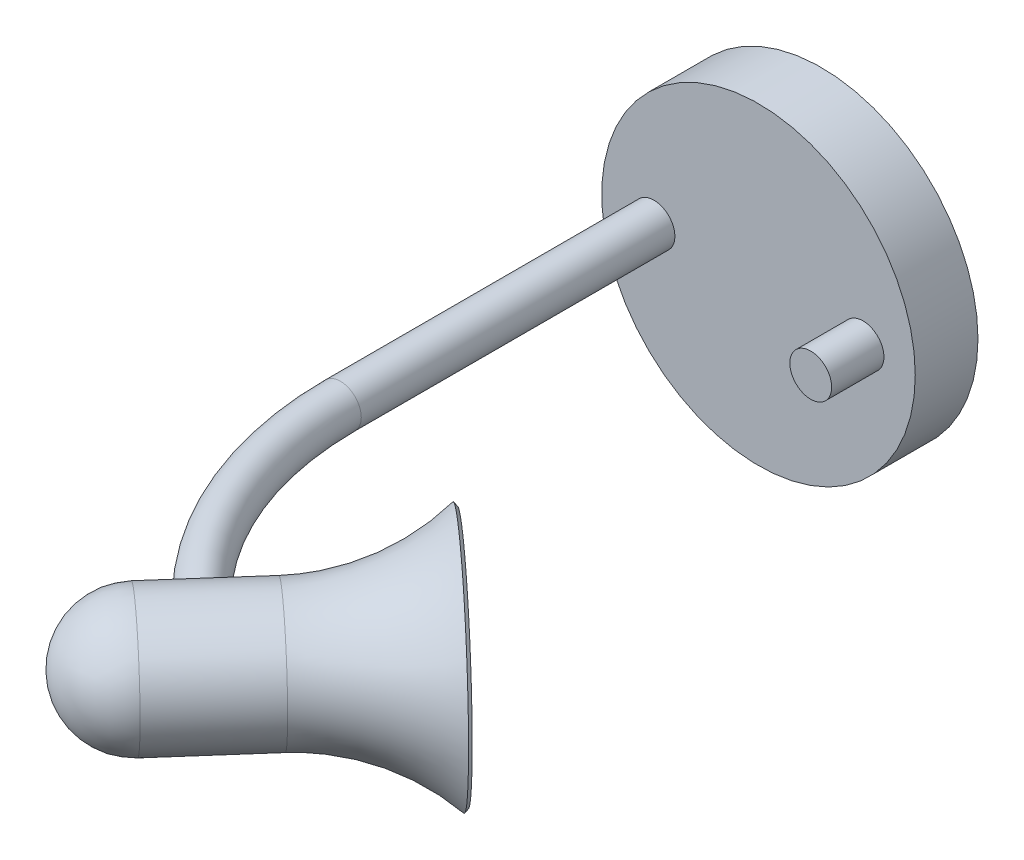
ISO-10303-21;
HEADER;
FILE_DESCRIPTION(('STEP AP214'),'2;1');
FILE_NAME('part.step','',(''),(''),'','','');
FILE_SCHEMA(('AUTOMOTIVE_DESIGN { 1 0 10303 214 1 1 1 1 }'));
ENDSEC;
DATA;
#1=APPLICATION_CONTEXT('core data for automotive mechanical design processes');
#2=APPLICATION_PROTOCOL_DEFINITION('international standard','automotive_design',2000,#1);
#3=PRODUCT_CONTEXT('',#1,'mechanical');
#4=PRODUCT('Part','Part','',(#3));
#5=PRODUCT_RELATED_PRODUCT_CATEGORY('part','',(#4));
#6=PRODUCT_DEFINITION_FORMATION('','',#4);
#7=PRODUCT_DEFINITION_CONTEXT('part definition',#1,'design');
#8=PRODUCT_DEFINITION('design','',#6,#7);
#9=PRODUCT_DEFINITION_SHAPE('','',#8);
#10=(LENGTH_UNIT() NAMED_UNIT(*) SI_UNIT(.MILLI.,.METRE.));
#11=(NAMED_UNIT(*) PLANE_ANGLE_UNIT() SI_UNIT($,.RADIAN.));
#12=(NAMED_UNIT(*) SI_UNIT($,.STERADIAN.) SOLID_ANGLE_UNIT());
#13=UNCERTAINTY_MEASURE_WITH_UNIT(LENGTH_MEASURE(1.E-05),#10,'distance_accuracy_value','');
#14=(GEOMETRIC_REPRESENTATION_CONTEXT(3) GLOBAL_UNCERTAINTY_ASSIGNED_CONTEXT((#13)) GLOBAL_UNIT_ASSIGNED_CONTEXT((#10,
#11,#12)) REPRESENTATION_CONTEXT('',''));
#15=CARTESIAN_POINT('',(0.,0.,0.));
#16=DIRECTION('',(0.,0.,1.));
#17=DIRECTION('',(1.,0.,0.));
#18=AXIS2_PLACEMENT_3D('',#15,#16,#17);
#19=CARTESIAN_POINT('',(43.20589325157,0.,301.093134832984));
#20=DIRECTION('',(0.661437827766148,0.,-0.75));
#21=DIRECTION('',(-0.75,0.,-0.661437827766148));
#22=AXIS2_PLACEMENT_3D('',#19,#20,#21);
#23=TOROIDAL_SURFACE('',#22,120.,92.);
#24=CARTESIAN_POINT('',(83.6939830923323,0.,255.183956213542));
#25=DIRECTION('',(0.661437827766148,0.,-0.75));
#26=DIRECTION('',(-0.75,0.,-0.661437827766148));
#27=AXIS2_PLACEMENT_3D('',#24,#25,#26);
#28=CIRCLE('',#27,51.319130032195);
#29=CARTESIAN_POINT('',(122.183330616479,0.,289.128370104886));
#30=VERTEX_POINT('',#29);
#31=EDGE_CURVE('E11',#30,#30,#28,.T.);
#32=ORIENTED_EDGE('',*,*,#31,.T.);
#33=EDGE_LOOP('',(#32));
#34=FACE_BOUND('',#33,.T.);
#35=CARTESIAN_POINT('',(43.20589325157,0.,301.093134832984));
#36=DIRECTION('',(0.661437827766148,0.,-0.75));
#37=DIRECTION('',(-0.75,0.,-0.661437827766148));
#38=AXIS2_PLACEMENT_3D('',#35,#36,#37);
#39=CIRCLE('',#38,28.);
#40=CARTESIAN_POINT('',(22.20589325157,0.,282.572875655532));
#41=VERTEX_POINT('',#40);
#42=EDGE_CURVE('E63',#41,#41,#39,.T.);
#43=ORIENTED_EDGE('',*,*,#42,.F.);
#44=EDGE_LOOP('',(#43));
#45=FACE_BOUND('',#44,.T.);
#46=ADVANCED_FACE('F41',(#34,#45),#23,.T.);
#47=CARTESIAN_POINT('',(82.8138072262288,0.,256.181981835704));
#48=DIRECTION('',(-0.661437827766148,0.,0.75));
#49=DIRECTION('',(0.75,0.,0.661437827766148));
#50=AXIS2_PLACEMENT_3D('',#47,#48,#49);
#51=CONICAL_SURFACE('',#50,52.8121924227995,0.842833216253935);
#52=CARTESIAN_POINT('',(82.8138072262288,0.,256.181981835704));
#53=DIRECTION('',(0.661437827766148,0.,-0.75));
#54=DIRECTION('',(-0.75,0.,-0.661437827766148));
#55=AXIS2_PLACEMENT_3D('',#52,#53,#54);
#56=CIRCLE('',#55,52.8121924227995);
#57=CARTESIAN_POINT('',(122.422951543328,0.,291.113963671408));
#58=VERTEX_POINT('',#57);
#59=EDGE_CURVE('E47',#58,#58,#56,.T.);
#60=CARTESIAN_POINT('',(122.183330616479,0.,289.128370104886));
#61=CARTESIAN_POINT('',(122.1858266678,0.,289.149053371204));
#62=CARTESIAN_POINT('',(122.188322719121,0.,289.169736637522));
#63=CARTESIAN_POINT('',(122.193314821764,0.,289.211103170158));
#64=CARTESIAN_POINT('',(122.195810873085,0.,289.231786436476));
#65=CARTESIAN_POINT('',(122.200802975728,0.,289.273152969112));
#66=CARTESIAN_POINT('',(122.203299027049,0.,289.293836235429));
#67=CARTESIAN_POINT('',(122.208291129692,0.,289.335202768065));
#68=CARTESIAN_POINT('',(122.210787181013,0.,289.355886034383));
#69=CARTESIAN_POINT('',(122.215779283656,0.,289.397252567019));
#70=CARTESIAN_POINT('',(122.218275334978,0.,289.417935833337));
#71=CARTESIAN_POINT('',(122.22326743762,0.,289.459302365973));
#72=CARTESIAN_POINT('',(122.225763488942,0.,289.479985632291));
#73=CARTESIAN_POINT('',(122.230755591584,0.,289.521352164927));
#74=CARTESIAN_POINT('',(122.233251642906,0.,289.542035431245));
#75=CARTESIAN_POINT('',(122.238243745548,0.,289.583401963881));
#76=CARTESIAN_POINT('',(122.24073979687,0.,289.604085230199));
#77=CARTESIAN_POINT('',(122.245731899512,0.,289.645451762835));
#78=CARTESIAN_POINT('',(122.248227950834,0.,289.666135029152));
#79=CARTESIAN_POINT('',(122.253220053476,0.,289.707501561788));
#80=CARTESIAN_POINT('',(122.255716104798,0.,289.728184828106));
#81=CARTESIAN_POINT('',(122.260708207441,0.,289.769551360742));
#82=CARTESIAN_POINT('',(122.263204258762,0.,289.79023462706));
#83=CARTESIAN_POINT('',(122.268196361405,0.,289.831601159696));
#84=CARTESIAN_POINT('',(122.270692412726,0.,289.852284426014));
#85=CARTESIAN_POINT('',(122.275684515369,0.,289.89365095865));
#86=CARTESIAN_POINT('',(122.27818056669,0.,289.914334224968));
#87=CARTESIAN_POINT('',(122.283172669333,0.,289.955700757604));
#88=CARTESIAN_POINT('',(122.285668720654,0.,289.976384023922));
#89=CARTESIAN_POINT('',(122.290660823297,0.,290.017750556557));
#90=CARTESIAN_POINT('',(122.293156874618,0.,290.038433822875));
#91=CARTESIAN_POINT('',(122.298148977261,0.,290.079800355511));
#92=CARTESIAN_POINT('',(122.300645028582,0.,290.100483621829));
#93=CARTESIAN_POINT('',(122.305637131225,0.,290.141850154465));
#94=CARTESIAN_POINT('',(122.308133182546,0.,290.162533420783));
#95=CARTESIAN_POINT('',(122.313125285189,0.,290.203899953419));
#96=CARTESIAN_POINT('',(122.31562133651,0.,290.224583219737));
#97=CARTESIAN_POINT('',(122.320613439153,0.,290.265949752373));
#98=CARTESIAN_POINT('',(122.323109490474,0.,290.286633018691));
#99=CARTESIAN_POINT('',(122.328101593117,0.,290.327999551327));
#100=CARTESIAN_POINT('',(122.330597644438,0.,290.348682817645));
#101=CARTESIAN_POINT('',(122.335589747081,0.,290.39004935028));
#102=CARTESIAN_POINT('',(122.338085798402,0.,290.410732616598));
#103=CARTESIAN_POINT('',(122.343077901045,0.,290.452099149234));
#104=CARTESIAN_POINT('',(122.345573952367,0.,290.472782415552));
#105=CARTESIAN_POINT('',(122.350566055009,0.,290.514148948188));
#106=CARTESIAN_POINT('',(122.353062106331,0.,290.534832214506));
#107=CARTESIAN_POINT('',(122.358054208973,0.,290.576198747142));
#108=CARTESIAN_POINT('',(122.360550260295,0.,290.59688201346));
#109=CARTESIAN_POINT('',(122.365542362937,0.,290.638248546096));
#110=CARTESIAN_POINT('',(122.368038414259,0.,290.658931812414));
#111=CARTESIAN_POINT('',(122.373030516901,0.,290.70029834505));
#112=CARTESIAN_POINT('',(122.375526568223,0.,290.720981611368));
#113=CARTESIAN_POINT('',(122.380518670865,0.,290.762348144003));
#114=CARTESIAN_POINT('',(122.383014722187,0.,290.783031410321));
#115=CARTESIAN_POINT('',(122.388006824829,0.,290.824397942957));
#116=CARTESIAN_POINT('',(122.390502876151,0.,290.845081209275));
#117=CARTESIAN_POINT('',(122.395494978794,0.,290.886447741911));
#118=CARTESIAN_POINT('',(122.397991030115,0.,290.907131008229));
#119=CARTESIAN_POINT('',(122.402983132758,0.,290.948497540865));
#120=CARTESIAN_POINT('',(122.405479184079,0.,290.969180807183));
#121=CARTESIAN_POINT('',(122.410471286722,0.,291.010547339819));
#122=CARTESIAN_POINT('',(122.412967338043,0.,291.031230606137));
#123=CARTESIAN_POINT('',(122.417959440686,0.,291.072597138773));
#124=CARTESIAN_POINT('',(122.420455492007,0.,291.093280405091));
#125=CARTESIAN_POINT('',(122.422951543328,0.,291.113963671408));
#126=B_SPLINE_CURVE_WITH_KNOTS('',3,(#60,#61,#62,#63,#64,#65,#66,#67,#68,#69,#70,#71,#72,#73,
#74,#75,#76,#77,#78,#79,#80,#81,#82,#83,#84,#85,#86,#87,#88,#89,#90,#91,#92,#93,#94,#95,#96,#97,
#98,#99,#100,#101,#102,#103,#104,#105,#106,#107,#108,#109,#110,#111,#112,#113,#114,#115,#116,
#117,#118,#119,#120,#121,#122,#123,#124,#125),.UNSPECIFIED.,.F.,.F.,(4,2,2,2,2,2,2,2,2,2,2,2,2,
2,2,2,2,2,2,2,2,2,2,2,2,2,2,2,2,2,2,2,4),(0.,0.062499999999971,0.124999999999944,
0.187500000000025,0.249999999999997,0.312499999999967,0.374999999999939,0.437500000000022,
0.499999999999995,0.562499999999968,0.624999999999937,0.68750000000002,0.749999999999992,
0.812499999999963,0.874999999999934,0.937500000000017,0.99999999999999,1.06249999999996,
1.12499999999999,1.18750000000001,1.24999999999999,1.31249999999996,1.37500000000004,
1.43750000000001,1.49999999999999,1.56250000000001,1.62500000000004,1.68750000000001,
1.74999999999998,1.81250000000001,1.87500000000004,1.93750000000001,2.00000000000004),.UNSPECIFIED.);
#127=EDGE_CURVE('BSEAM71',#30,#58,#126,.T.);
#128=ORIENTED_EDGE('',*,*,#31,.F.);
#129=ORIENTED_EDGE('',*,*,#59,.T.);
#130=ORIENTED_EDGE('',*,*,#127,.T.);
#131=ORIENTED_EDGE('',*,*,#127,.F.);
#132=EDGE_LOOP('',(#128,#130,#129,#131));
#133=FACE_BOUND('',#132,.T.);
#134=ADVANCED_FACE('F71',(#133),#51,.T.);
#135=CARTESIAN_POINT('',(43.20589325157,0.,301.093134832984));
#136=DIRECTION('',(0.661437827766148,0.,-0.75));
#137=DIRECTION('',(-0.75,0.,-0.661437827766148));
#138=AXIS2_PLACEMENT_3D('',#135,#136,#137);
#139=TOROIDAL_SURFACE('',#138,120.,90.);
#140=ORIENTED_EDGE('',*,*,#59,.F.);
#141=EDGE_LOOP('',(#140));
#142=FACE_BOUND('',#141,.T.);
#143=CARTESIAN_POINT('',(43.20589325157,0.,301.093134832984));
#144=DIRECTION('',(0.661437827766148,0.,-0.75));
#145=DIRECTION('',(-0.75,0.,-0.661437827766148));
#146=AXIS2_PLACEMENT_3D('',#143,#144,#145);
#147=CIRCLE('',#146,30.);
#148=CARTESIAN_POINT('',(20.70589325157,0.,281.25));
#149=VERTEX_POINT('',#148);
#150=EDGE_CURVE('E51',#149,#149,#147,.T.);
#151=ORIENTED_EDGE('',*,*,#150,.T.);
#152=EDGE_LOOP('',(#151));
#153=FACE_BOUND('',#152,.T.);
#154=ADVANCED_FACE('F75',(#142,#153),#139,.F.);
#155=CARTESIAN_POINT('',(158.834137133066,0.,169.983030042028));
#156=DIRECTION('',(0.661437827766148,0.,-0.75));
#157=DIRECTION('',(-0.75,0.,-0.661437827766148));
#158=AXIS2_PLACEMENT_3D('',#155,#156,#157);
#159=CYLINDRICAL_SURFACE('',#158,30.);
#160=CARTESIAN_POINT('',(10.1340018632626,0.,338.593134832984));
#161=DIRECTION('',(0.661437827766148,0.,-0.75));
#162=DIRECTION('',(-0.75,0.,-0.661437827766148));
#163=AXIS2_PLACEMENT_3D('',#160,#161,#162);
#164=CIRCLE('',#163,30.);
#165=CARTESIAN_POINT('',(-12.3659981367374,0.,318.75));
#166=VERTEX_POINT('',#165);
#167=EDGE_CURVE('E55',#166,#166,#164,.T.);
#168=CARTESIAN_POINT('',(20.70589325157,0.,281.25));
#169=CARTESIAN_POINT('',(20.3613943829418,0.,281.640625));
#170=CARTESIAN_POINT('',(20.0168955143136,0.,282.03125));
#171=CARTESIAN_POINT('',(19.3278977770572,0.,282.8125));
#172=CARTESIAN_POINT('',(18.983398908429,0.,283.203125));
#173=CARTESIAN_POINT('',(18.2944011711726,0.,283.984375));
#174=CARTESIAN_POINT('',(17.9499023025444,0.,284.375));
#175=CARTESIAN_POINT('',(17.260904565288,0.,285.15625));
#176=CARTESIAN_POINT('',(16.9164056966598,0.,285.546875));
#177=CARTESIAN_POINT('',(16.2274079594034,0.,286.328125));
#178=CARTESIAN_POINT('',(15.8829090907752,0.,286.71875));
#179=CARTESIAN_POINT('',(15.1939113535188,0.,287.5));
#180=CARTESIAN_POINT('',(14.8494124848906,0.,287.890625));
#181=CARTESIAN_POINT('',(14.1604147476341,0.,288.671875));
#182=CARTESIAN_POINT('',(13.8159158790059,0.,289.0625));
#183=CARTESIAN_POINT('',(13.1269181417495,0.,289.84375));
#184=CARTESIAN_POINT('',(12.7824192731214,0.,290.234375));
#185=CARTESIAN_POINT('',(12.0934215358649,0.,291.015625));
#186=CARTESIAN_POINT('',(11.7489226672367,0.,291.40625));
#187=CARTESIAN_POINT('',(11.0599249299803,0.,292.1875));
#188=CARTESIAN_POINT('',(10.7154260613522,0.,292.578125));
#189=CARTESIAN_POINT('',(10.0264283240957,0.,293.359375));
#190=CARTESIAN_POINT('',(9.68192945546752,0.,293.75));
#191=CARTESIAN_POINT('',(8.9929317182111,0.,294.53125));
#192=CARTESIAN_POINT('',(8.64843284958291,0.,294.921875));
#193=CARTESIAN_POINT('',(7.95943511232652,0.,295.703125));
#194=CARTESIAN_POINT('',(7.61493624369832,0.,296.09375));
#195=CARTESIAN_POINT('',(6.9259385064419,0.,296.875));
#196=CARTESIAN_POINT('',(6.58143963781369,0.,297.265625));
#197=CARTESIAN_POINT('',(5.89244190055729,0.,298.046875));
#198=CARTESIAN_POINT('',(5.5479430319291,0.,298.4375));
#199=CARTESIAN_POINT('',(4.8589452946727,0.,299.21875));
#200=CARTESIAN_POINT('',(4.51444642604449,0.,299.609375));
#201=CARTESIAN_POINT('',(3.82544868878809,0.,300.390625));
#202=CARTESIAN_POINT('',(3.48094982015989,0.,300.78125));
#203=CARTESIAN_POINT('',(2.79195208290349,0.,301.5625));
#204=CARTESIAN_POINT('',(2.44745321427529,0.,301.953125));
#205=CARTESIAN_POINT('',(1.75845547701888,0.,302.734375));
#206=CARTESIAN_POINT('',(1.41395660839068,0.,303.125));
#207=CARTESIAN_POINT('',(0.724958871134262,0.,303.90625));
#208=CARTESIAN_POINT('',(0.380460002506057,0.,304.296875));
#209=CARTESIAN_POINT('',(-0.308537734750345,0.,305.078125));
#210=CARTESIAN_POINT('',(-0.653036603378541,0.,305.46875));
#211=CARTESIAN_POINT('',(-1.34203434063494,0.,306.25));
#212=CARTESIAN_POINT('',(-1.68653320926314,0.,306.640625));
#213=CARTESIAN_POINT('',(-2.37553094651955,0.,307.421875));
#214=CARTESIAN_POINT('',(-2.72002981514776,0.,307.8125));
#215=CARTESIAN_POINT('',(-3.40902755240416,0.,308.59375));
#216=CARTESIAN_POINT('',(-3.75352642103235,0.,308.984375));
#217=CARTESIAN_POINT('',(-4.44252415828875,0.,309.765625));
#218=CARTESIAN_POINT('',(-4.78702302691696,0.,310.15625));
#219=CARTESIAN_POINT('',(-5.47602076417336,0.,310.9375));
#220=CARTESIAN_POINT('',(-5.82051963280156,0.,311.328125));
#221=CARTESIAN_POINT('',(-6.50951737005797,0.,312.109375));
#222=CARTESIAN_POINT('',(-6.85401623868618,0.,312.5));
#223=CARTESIAN_POINT('',(-7.54301397594259,0.,313.28125));
#224=CARTESIAN_POINT('',(-7.88751284457079,0.,313.671875));
#225=CARTESIAN_POINT('',(-8.57651058182718,0.,314.453125));
#226=CARTESIAN_POINT('',(-8.92100945045539,0.,314.84375));
#227=CARTESIAN_POINT('',(-9.61000718771181,0.,315.625));
#228=CARTESIAN_POINT('',(-9.95450605634002,0.,316.015625));
#229=CARTESIAN_POINT('',(-10.6435037935964,0.,316.796875));
#230=CARTESIAN_POINT('',(-10.9880026622246,0.,317.1875));
#231=CARTESIAN_POINT('',(-11.677000399481,0.,317.96875));
#232=CARTESIAN_POINT('',(-12.0214992681092,0.,318.359375));
#233=CARTESIAN_POINT('',(-12.3659981367374,0.,318.75));
#234=B_SPLINE_CURVE_WITH_KNOTS('',3,(#168,#169,#170,#171,#172,#173,#174,#175,#176,#177,#178,
#179,#180,#181,#182,#183,#184,#185,#186,#187,#188,#189,#190,#191,#192,#193,#194,#195,#196,#197,
#198,#199,#200,#201,#202,#203,#204,#205,#206,#207,#208,#209,#210,#211,#212,#213,#214,#215,#216,
#217,#218,#219,#220,#221,#222,#223,#224,#225,#226,#227,#228,#229,#230,#231,#232,#233),
.UNSPECIFIED.,.F.,.F.,(4,2,2,2,2,2,2,2,2,2,2,2,2,2,2,2,2,2,2,2,2,2,2,2,2,2,2,2,2,2,2,2,4),(0.,
1.56249999999999,3.12499999999998,4.68750000000002,6.24999999999996,7.81249999999999,9.375,
10.9375,12.5,14.0625,15.625,17.1875,18.75,20.3125,21.875,23.4375,25.,26.5625,28.125,29.6875,
31.25,32.8125,34.375,35.9375,37.5,39.0625,40.625,42.1875,43.75,45.3125,46.875,48.4375,50.),.UNSPECIFIED.);
#235=EDGE_CURVE('BSEAM80',#149,#166,#234,.T.);
#236=ORIENTED_EDGE('',*,*,#150,.F.);
#237=ORIENTED_EDGE('',*,*,#167,.T.);
#238=ORIENTED_EDGE('',*,*,#235,.T.);
#239=ORIENTED_EDGE('',*,*,#235,.F.);
#240=EDGE_LOOP('',(#236,#238,#237,#239));
#241=FACE_BOUND('',#240,.T.);
#242=ADVANCED_FACE('F80',(#241),#159,.T.);
#243=CARTESIAN_POINT('',(10.1340018632626,0.,338.593134832984));
#244=DIRECTION('',(0.661437827766148,0.,-0.75));
#245=DIRECTION('',(0.75,0.,0.661437827766148));
#246=AXIS2_PLACEMENT_3D('',#243,#244,#245);
#247=SPHERICAL_SURFACE('',#246,30.);
#248=ORIENTED_EDGE('',*,*,#167,.F.);
#249=EDGE_LOOP('',(#248));
#250=FACE_BOUND('',#249,.T.);
#251=ADVANCED_FACE('F86',(#250),#247,.T.);
#252=CARTESIAN_POINT('',(10.1340018632626,0.,338.593134832984));
#253=DIRECTION('',(0.661437827766148,0.,-0.75));
#254=DIRECTION('',(0.75,0.,0.661437827766148));
#255=AXIS2_PLACEMENT_3D('',#252,#253,#254);
#256=SPHERICAL_SURFACE('',#255,28.);
#257=CARTESIAN_POINT('',(10.1340018632626,0.,338.593134832984));
#258=DIRECTION('',(0.661437827766148,0.,-0.75));
#259=DIRECTION('',(-0.75,0.,-0.661437827766148));
#260=AXIS2_PLACEMENT_3D('',#257,#258,#259);
#261=CIRCLE('',#260,28.);
#262=CARTESIAN_POINT('',(-10.8659981367374,0.,320.072875655532));
#263=VERTEX_POINT('',#262);
#264=EDGE_CURVE('E60',#263,#263,#261,.T.);
#265=ORIENTED_EDGE('',*,*,#264,.T.);
#266=EDGE_LOOP('',(#265));
#267=FACE_BOUND('',#266,.T.);
#268=ADVANCED_FACE('F90',(#267),#256,.F.);
#269=CARTESIAN_POINT('',(158.834137133066,0.,169.983030042028));
#270=DIRECTION('',(0.661437827766148,0.,-0.75));
#271=DIRECTION('',(-0.75,0.,-0.661437827766148));
#272=AXIS2_PLACEMENT_3D('',#269,#270,#271);
#273=CYLINDRICAL_SURFACE('',#272,28.);
#274=CARTESIAN_POINT('',(22.20589325157,0.,282.572875655532));
#275=CARTESIAN_POINT('',(21.8613943829418,0.,282.963500655532));
#276=CARTESIAN_POINT('',(21.5168955143136,0.,283.354125655532));
#277=CARTESIAN_POINT('',(20.8278977770572,0.,284.135375655532));
#278=CARTESIAN_POINT('',(20.483398908429,0.,284.526000655532));
#279=CARTESIAN_POINT('',(19.7944011711726,0.,285.307250655532));
#280=CARTESIAN_POINT('',(19.4499023025444,0.,285.697875655532));
#281=CARTESIAN_POINT('',(18.760904565288,0.,286.479125655532));
#282=CARTESIAN_POINT('',(18.4164056966598,0.,286.869750655532));
#283=CARTESIAN_POINT('',(17.7274079594034,0.,287.651000655532));
#284=CARTESIAN_POINT('',(17.3829090907752,0.,288.041625655532));
#285=CARTESIAN_POINT('',(16.6939113535188,0.,288.822875655532));
#286=CARTESIAN_POINT('',(16.3494124848906,0.,289.213500655532));
#287=CARTESIAN_POINT('',(15.6604147476342,0.,289.994750655532));
#288=CARTESIAN_POINT('',(15.315915879006,0.,290.385375655532));
#289=CARTESIAN_POINT('',(14.6269181417496,0.,291.166625655532));
#290=CARTESIAN_POINT('',(14.2824192731213,0.,291.557250655532));
#291=CARTESIAN_POINT('',(13.5934215358649,0.,292.338500655532));
#292=CARTESIAN_POINT('',(13.2489226672367,0.,292.729125655532));
#293=CARTESIAN_POINT('',(12.5599249299803,0.,293.510375655532));
#294=CARTESIAN_POINT('',(12.2154260613522,0.,293.901000655532));
#295=CARTESIAN_POINT('',(11.5264283240957,0.,294.682250655532));
#296=CARTESIAN_POINT('',(11.1819294554675,0.,295.072875655532));
#297=CARTESIAN_POINT('',(10.4929317182111,0.,295.854125655532));
#298=CARTESIAN_POINT('',(10.148432849583,0.,296.244750655532));
#299=CARTESIAN_POINT('',(9.45943511232654,0.,297.026000655532));
#300=CARTESIAN_POINT('',(9.11493624369831,0.,297.416625655532));
#301=CARTESIAN_POINT('',(8.4259385064419,0.,298.197875655532));
#302=CARTESIAN_POINT('',(8.08143963781372,0.,298.588500655532));
#303=CARTESIAN_POINT('',(7.39244190055732,0.,299.369750655532));
#304=CARTESIAN_POINT('',(7.04794303192911,0.,299.760375655532));
#305=CARTESIAN_POINT('',(6.3589452946727,0.,300.541625655532));
#306=CARTESIAN_POINT('',(6.01444642604451,0.,300.932250655532));
#307=CARTESIAN_POINT('',(5.32544868878811,0.,301.713500655532));
#308=CARTESIAN_POINT('',(4.9809498201599,0.,302.104125655532));
#309=CARTESIAN_POINT('',(4.2919520829035,0.,302.885375655532));
#310=CARTESIAN_POINT('',(3.94745321427531,0.,303.276000655532));
#311=CARTESIAN_POINT('',(3.25845547701891,0.,304.057250655532));
#312=CARTESIAN_POINT('',(2.9139566083907,0.,304.447875655532));
#313=CARTESIAN_POINT('',(2.22495887113429,0.,305.229125655532));
#314=CARTESIAN_POINT('',(1.88046000250609,0.,305.619750655532));
#315=CARTESIAN_POINT('',(1.19146226524969,0.,306.401000655532));
#316=CARTESIAN_POINT('',(0.846963396621495,0.,306.791625655532));
#317=CARTESIAN_POINT('',(0.157965659365093,0.,307.572875655532));
#318=CARTESIAN_POINT('',(-0.186533209263113,0.,307.963500655532));
#319=CARTESIAN_POINT('',(-0.875530946519525,0.,308.744750655532));
#320=CARTESIAN_POINT('',(-1.22002981514773,0.,309.135375655532));
#321=CARTESIAN_POINT('',(-1.90902755240413,0.,309.916625655532));
#322=CARTESIAN_POINT('',(-2.25352642103233,0.,310.307250655532));
#323=CARTESIAN_POINT('',(-2.94252415828873,0.,311.088500655532));
#324=CARTESIAN_POINT('',(-3.28702302691693,0.,311.479125655532));
#325=CARTESIAN_POINT('',(-3.97602076417334,0.,312.260375655532));
#326=CARTESIAN_POINT('',(-4.32051963280155,0.,312.651000655532));
#327=CARTESIAN_POINT('',(-5.00951737005795,0.,313.432250655532));
#328=CARTESIAN_POINT('',(-5.35401623868614,0.,313.822875655532));
#329=CARTESIAN_POINT('',(-6.04301397594254,0.,314.604125655532));
#330=CARTESIAN_POINT('',(-6.38751284457075,0.,314.994750655532));
#331=CARTESIAN_POINT('',(-7.07651058182715,0.,315.776000655532));
#332=CARTESIAN_POINT('',(-7.42100945045535,0.,316.166625655532));
#333=CARTESIAN_POINT('',(-8.11000718771175,0.,316.947875655532));
#334=CARTESIAN_POINT('',(-8.45450605633997,0.,317.338500655532));
#335=CARTESIAN_POINT('',(-9.14350379359638,0.,318.119750655532));
#336=CARTESIAN_POINT('',(-9.48800266222457,0.,318.510375655532));
#337=CARTESIAN_POINT('',(-10.177000399481,0.,319.291625655532));
#338=CARTESIAN_POINT('',(-10.5214992681092,0.,319.682250655532));
#339=CARTESIAN_POINT('',(-10.8659981367374,0.,320.072875655532));
#340=B_SPLINE_CURVE_WITH_KNOTS('',3,(#274,#275,#276,#277,#278,#279,#280,#281,#282,#283,#284,
#285,#286,#287,#288,#289,#290,#291,#292,#293,#294,#295,#296,#297,#298,#299,#300,#301,#302,#303,
#304,#305,#306,#307,#308,#309,#310,#311,#312,#313,#314,#315,#316,#317,#318,#319,#320,#321,#322,
#323,#324,#325,#326,#327,#328,#329,#330,#331,#332,#333,#334,#335,#336,#337,#338,#339),
.UNSPECIFIED.,.F.,.F.,(4,2,2,2,2,2,2,2,2,2,2,2,2,2,2,2,2,2,2,2,2,2,2,2,2,2,2,2,2,2,2,2,4),(0.,
1.56249999999999,3.12499999999998,4.68749999999998,6.25000000000001,7.81249999999999,
9.37499999999998,10.9375,12.5,14.0625,15.625,17.1875,18.75,20.3125,21.875,23.4375,25.,26.5625,
28.125,29.6875,31.25,32.8125,34.375,35.9375,37.5,39.0625,40.625,42.1875,43.75,45.3124999999999,
46.875,48.4375,50.),.UNSPECIFIED.);
#341=EDGE_CURVE('BSEAM67',#41,#263,#340,.T.);
#342=ORIENTED_EDGE('',*,*,#42,.T.);
#343=ORIENTED_EDGE('',*,*,#264,.F.);
#344=ORIENTED_EDGE('',*,*,#341,.T.);
#345=ORIENTED_EDGE('',*,*,#341,.F.);
#346=EDGE_LOOP('',(#342,#344,#343,#345));
#347=FACE_BOUND('',#346,.T.);
#348=ADVANCED_FACE('F67',(#347),#273,.F.);
#349=CLOSED_SHELL('',(#46,#134,#154,#242,#251,#268,#348));
#350=MANIFOLD_SOLID_BREP('B2',#349);
#351=CARTESIAN_POINT('',(0.,0.,30.));
#352=DIRECTION('',(0.,0.,-1.));
#353=DIRECTION('',(-1.,0.,0.));
#354=AXIS2_PLACEMENT_3D('',#351,#352,#353);
#355=CYLINDRICAL_SURFACE('',#354,75.);
#356=CARTESIAN_POINT('',(0.,0.,30.));
#357=DIRECTION('',(0.,0.,1.));
#358=DIRECTION('',(1.,0.,0.));
#359=AXIS2_PLACEMENT_3D('',#356,#357,#358);
#360=CIRCLE('',#359,75.);
#361=CARTESIAN_POINT('',(75.,0.,30.));
#362=VERTEX_POINT('',#361);
#363=EDGE_CURVE('E148',#362,#362,#360,.T.);
#364=ORIENTED_EDGE('',*,*,#363,.F.);
#365=EDGE_LOOP('',(#364));
#366=FACE_BOUND('',#365,.T.);
#367=CARTESIAN_POINT('',(0.,0.,0.));
#368=DIRECTION('',(0.,0.,1.));
#369=DIRECTION('',(1.,0.,0.));
#370=AXIS2_PLACEMENT_3D('',#367,#368,#369);
#371=CIRCLE('',#370,75.);
#372=CARTESIAN_POINT('',(75.,0.,0.));
#373=VERTEX_POINT('',#372);
#374=EDGE_CURVE('E152',#373,#373,#371,.T.);
#375=ORIENTED_EDGE('',*,*,#374,.T.);
#376=EDGE_LOOP('',(#375));
#377=FACE_BOUND('',#376,.T.);
#378=ADVANCED_FACE('F142',(#366,#377),#355,.T.);
#379=CARTESIAN_POINT('',(0.,0.,30.));
#380=DIRECTION('',(0.,0.,1.));
#381=DIRECTION('',(1.,0.,0.));
#382=AXIS2_PLACEMENT_3D('',#379,#380,#381);
#383=PLANE('',#382);
#384=CARTESIAN_POINT('',(-50.,0.,30.));
#385=DIRECTION('',(0.,0.,1.));
#386=DIRECTION('',(1.,0.,0.));
#387=AXIS2_PLACEMENT_3D('',#384,#385,#386);
#388=CIRCLE('',#387,10.);
#389=CARTESIAN_POINT('',(-40.,0.,30.));
#390=VERTEX_POINT('',#389);
#391=EDGE_CURVE('E40',#390,#390,#388,.T.);
#392=ORIENTED_EDGE('',*,*,#391,.F.);
#393=EDGE_LOOP('',(#392));
#394=FACE_BOUND('',#393,.T.);
#395=CARTESIAN_POINT('',(50.,0.,30.));
#396=DIRECTION('',(0.,0.,1.));
#397=DIRECTION('',(1.,0.,0.));
#398=AXIS2_PLACEMENT_3D('',#395,#396,#397);
#399=CIRCLE('',#398,9.99999999999999);
#400=CARTESIAN_POINT('',(60.,0.,30.));
#401=VERTEX_POINT('',#400);
#402=EDGE_CURVE('E159',#401,#401,#399,.T.);
#403=ORIENTED_EDGE('',*,*,#402,.F.);
#404=EDGE_LOOP('',(#403));
#405=FACE_BOUND('',#404,.T.);
#406=ORIENTED_EDGE('',*,*,#363,.T.);
#407=EDGE_LOOP('',(#406));
#408=FACE_BOUND('',#407,.T.);
#409=ADVANCED_FACE('F187',(#394,#405,#408),#383,.T.);
#410=CARTESIAN_POINT('',(0.,0.,0.));
#411=DIRECTION('',(0.,0.,1.));
#412=DIRECTION('',(1.,0.,0.));
#413=AXIS2_PLACEMENT_3D('',#410,#411,#412);
#414=PLANE('',#413);
#415=ORIENTED_EDGE('',*,*,#374,.F.);
#416=EDGE_LOOP('',(#415));
#417=FACE_BOUND('',#416,.T.);
#418=ADVANCED_FACE('F192',(#417),#414,.F.);
#419=CARTESIAN_POINT('',(50.,0.,55.));
#420=DIRECTION('',(0.,0.,-1.));
#421=DIRECTION('',(-1.,0.,0.));
#422=AXIS2_PLACEMENT_3D('',#419,#420,#421);
#423=CYLINDRICAL_SURFACE('',#422,9.99999999999999);
#424=CARTESIAN_POINT('',(50.,0.,55.));
#425=DIRECTION('',(0.,0.,1.));
#426=DIRECTION('',(1.,0.,0.));
#427=AXIS2_PLACEMENT_3D('',#424,#425,#426);
#428=CIRCLE('',#427,9.99999999999999);
#429=CARTESIAN_POINT('',(60.,0.,55.));
#430=VERTEX_POINT('',#429);
#431=EDGE_CURVE('E157',#430,#430,#428,.T.);
#432=ORIENTED_EDGE('',*,*,#431,.F.);
#433=EDGE_LOOP('',(#432));
#434=FACE_BOUND('',#433,.T.);
#435=ORIENTED_EDGE('',*,*,#402,.T.);
#436=EDGE_LOOP('',(#435));
#437=FACE_BOUND('',#436,.T.);
#438=ADVANCED_FACE('F199',(#434,#437),#423,.T.);
#439=CARTESIAN_POINT('',(50.,0.,55.));
#440=DIRECTION('',(0.,0.,1.));
#441=DIRECTION('',(1.,0.,0.));
#442=AXIS2_PLACEMENT_3D('',#439,#440,#441);
#443=PLANE('',#442);
#444=ORIENTED_EDGE('',*,*,#431,.T.);
#445=EDGE_LOOP('',(#444));
#446=FACE_BOUND('',#445,.T.);
#447=ADVANCED_FACE('F183',(#446),#443,.T.);
#448=CARTESIAN_POINT('',(4.16994755741629,0.,300.));
#449=DIRECTION('',(0.75,0.,0.661437827766148));
#450=DIRECTION('',(0.661437827766148,0.,-0.75));
#451=AXIS2_PLACEMENT_3D('',#448,#449,#450);
#452=PLANE('',#451);
#453=CARTESIAN_POINT('',(4.16994755741629,0.,300.));
#454=DIRECTION('',(0.75,0.,0.661437827766148));
#455=DIRECTION('',(0.661437827766148,0.,-0.75));
#456=AXIS2_PLACEMENT_3D('',#453,#454,#455);
#457=CIRCLE('',#456,10.);
#458=CARTESIAN_POINT('',(-2.44443072024521,0.,307.5));
#459=VERTEX_POINT('',#458);
#460=EDGE_CURVE('E162',#459,#459,#457,.T.);
#461=ORIENTED_EDGE('',*,*,#460,.T.);
#462=EDGE_LOOP('',(#461));
#463=FACE_BOUND('',#462,.T.);
#464=ADVANCED_FACE('F175',(#463),#452,.T.);
#465=CARTESIAN_POINT('',(-50.,0.,30.));
#466=DIRECTION('',(0.,0.,1.));
#467=DIRECTION('',(1.,0.,0.));
#468=AXIS2_PLACEMENT_3D('',#465,#466,#467);
#469=CYLINDRICAL_SURFACE('',#468,10.);
#470=CARTESIAN_POINT('',(-50.,0.,180.));
#471=DIRECTION('',(0.,0.,1.));
#472=DIRECTION('',(1.,0.,0.));
#473=AXIS2_PLACEMENT_3D('',#470,#471,#472);
#474=CIRCLE('',#473,10.);
#475=CARTESIAN_POINT('',(-60.,0.,180.));
#476=VERTEX_POINT('',#475);
#477=EDGE_CURVE('E167',#476,#476,#474,.T.);
#478=ORIENTED_EDGE('',*,*,#477,.F.);
#479=EDGE_LOOP('',(#478));
#480=FACE_BOUND('',#479,.T.);
#481=ORIENTED_EDGE('',*,*,#391,.T.);
#482=EDGE_LOOP('',(#481));
#483=FACE_BOUND('',#482,.T.);
#484=ADVANCED_FACE('F173',(#480,#483),#469,.T.);
#485=CARTESIAN_POINT('',(110.,0.,180.));
#486=DIRECTION('',(0.,1.,0.));
#487=DIRECTION('',(0.,0.,1.));
#488=AXIS2_PLACEMENT_3D('',#485,#486,#487);
#489=TOROIDAL_SURFACE('',#488,160.,10.);
#490=CARTESIAN_POINT('',(110.,0.,180.));
#491=DIRECTION('',(0.,1.,0.));
#492=DIRECTION('',(0.,0.,1.));
#493=AXIS2_PLACEMENT_3D('',#490,#491,#492);
#494=CIRCLE('',#493,170.);
#495=EDGE_CURVE('',#476,#459,#494,.T.);
#496=ORIENTED_EDGE('',*,*,#477,.T.);
#497=ORIENTED_EDGE('',*,*,#460,.F.);
#498=ORIENTED_EDGE('',*,*,#495,.T.);
#499=ORIENTED_EDGE('',*,*,#495,.F.);
#500=EDGE_LOOP('',(#496,#498,#497,#499));
#501=FACE_BOUND('',#500,.T.);
#502=ADVANCED_FACE('F171',(#501),#489,.T.);
#503=CLOSED_SHELL('',(#378,#409,#418,#438,#447,#464,#484,#502));
#504=MANIFOLD_SOLID_BREP('B6',#503);
#505=ADVANCED_BREP_SHAPE_REPRESENTATION('',(#18,#350,#504),#14);
#506=SHAPE_DEFINITION_REPRESENTATION(#9,#505);
ENDSEC;
END-ISO-10303-21;
